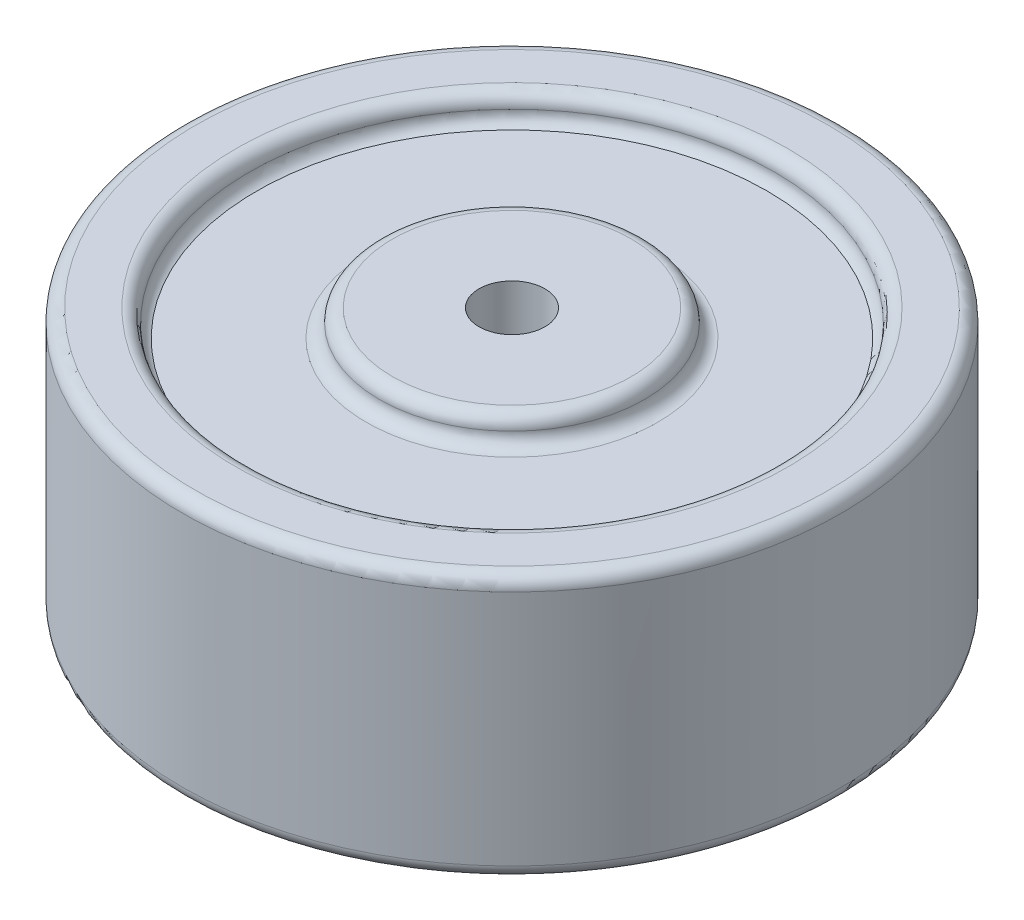
ISO-10303-21;
HEADER;
FILE_DESCRIPTION(('STEP AP214'),'2;1');
FILE_NAME('part.step','',(''),(''),'','','');
FILE_SCHEMA(('AUTOMOTIVE_DESIGN { 1 0 10303 214 1 1 1 1 }'));
ENDSEC;
DATA;
#1=APPLICATION_CONTEXT('core data for automotive mechanical design processes');
#2=APPLICATION_PROTOCOL_DEFINITION('international standard','automotive_design',2000,#1);
#3=PRODUCT_CONTEXT('',#1,'mechanical');
#4=PRODUCT('Part','Part','',(#3));
#5=PRODUCT_RELATED_PRODUCT_CATEGORY('part','',(#4));
#6=PRODUCT_DEFINITION_FORMATION('','',#4);
#7=PRODUCT_DEFINITION_CONTEXT('part definition',#1,'design');
#8=PRODUCT_DEFINITION('design','',#6,#7);
#9=PRODUCT_DEFINITION_SHAPE('','',#8);
#10=(LENGTH_UNIT() NAMED_UNIT(*) SI_UNIT(.MILLI.,.METRE.));
#11=(NAMED_UNIT(*) PLANE_ANGLE_UNIT() SI_UNIT($,.RADIAN.));
#12=(NAMED_UNIT(*) SI_UNIT($,.STERADIAN.) SOLID_ANGLE_UNIT());
#13=UNCERTAINTY_MEASURE_WITH_UNIT(LENGTH_MEASURE(1.E-05),#10,'distance_accuracy_value','');
#14=(GEOMETRIC_REPRESENTATION_CONTEXT(3) GLOBAL_UNCERTAINTY_ASSIGNED_CONTEXT((#13)) GLOBAL_UNIT_ASSIGNED_CONTEXT((#10,
#11,#12)) REPRESENTATION_CONTEXT('',''));
#15=CARTESIAN_POINT('',(0.,0.,0.));
#16=DIRECTION('',(0.,0.,1.));
#17=DIRECTION('',(1.,0.,0.));
#18=AXIS2_PLACEMENT_3D('',#15,#16,#17);
#19=CARTESIAN_POINT('',(0.,0.,0.));
#20=DIRECTION('',(0.,-1.,0.));
#21=DIRECTION('',(0.,0.,-0.999999999999996));
#22=AXIS2_PLACEMENT_3D('',#19,#20,#21);
#23=PLANE('',#22);
#24=CARTESIAN_POINT('',(0.,0.,0.));
#25=DIRECTION('',(0.,-1.,0.));
#26=DIRECTION('',(0.,0.,-0.999999999999996));
#27=AXIS2_PLACEMENT_3D('',#24,#25,#26);
#28=CIRCLE('',#27,2.5);
#29=CARTESIAN_POINT('',(0.,0.,-2.49999999999999));
#30=VERTEX_POINT('',#29);
#31=EDGE_CURVE('E125',#30,#30,#28,.F.);
#32=ORIENTED_EDGE('',*,*,#31,.F.);
#33=EDGE_LOOP('',(#32));
#34=FACE_BOUND('',#33,.T.);
#35=CARTESIAN_POINT('',(0.,0.,0.));
#36=DIRECTION('',(0.,-1.,0.));
#37=DIRECTION('',(0.,0.,-0.999999999999996));
#38=AXIS2_PLACEMENT_3D('',#35,#36,#37);
#39=CIRCLE('',#38,9.05594681126692);
#40=CARTESIAN_POINT('',(0.,0.,-9.05594681126689));
#41=VERTEX_POINT('',#40);
#42=EDGE_CURVE('E77',#41,#41,#39,.T.);
#43=ORIENTED_EDGE('',*,*,#42,.F.);
#44=EDGE_LOOP('',(#43));
#45=FACE_BOUND('',#44,.T.);
#46=ADVANCED_FACE('F51',(#34,#45),#23,.F.);
#47=CARTESIAN_POINT('',(0.,-0.999999999999834,1.4432899320127E-12));
#48=DIRECTION('',(0.,-1.,0.));
#49=DIRECTION('',(0.,0.,-0.999999999999996));
#50=AXIS2_PLACEMENT_3D('',#47,#48,#49);
#51=TOROIDAL_SURFACE('',#50,9.05594681126692,1.);
#52=CARTESIAN_POINT('',(0.,-0.999999999999834,1.4432899320127E-12));
#53=DIRECTION('',(0.,-1.,0.));
#54=DIRECTION('',(0.,0.,-0.999999999999996));
#55=AXIS2_PLACEMENT_3D('',#52,#53,#54);
#56=CIRCLE('',#55,10.0559468112669);
#57=CARTESIAN_POINT('',(0.,-0.999999999999837,-10.0559468112654));
#58=VERTEX_POINT('',#57);
#59=EDGE_CURVE('E81',#58,#58,#56,.T.);
#60=ORIENTED_EDGE('',*,*,#59,.F.);
#61=EDGE_LOOP('',(#60));
#62=FACE_BOUND('',#61,.T.);
#63=ORIENTED_EDGE('',*,*,#42,.T.);
#64=EDGE_LOOP('',(#63));
#65=FACE_BOUND('',#64,.T.);
#66=ADVANCED_FACE('F184',(#62,#65),#51,.T.);
#67=CARTESIAN_POINT('',(0.,-0.999999999999834,1.4432899320127E-12));
#68=DIRECTION('',(0.,-1.,0.));
#69=DIRECTION('',(0.,0.,-0.999999999999996));
#70=AXIS2_PLACEMENT_3D('',#67,#68,#69);
#71=TOROIDAL_SURFACE('',#70,11.0559468112669,1.);
#72=CARTESIAN_POINT('',(0.,-1.99999999999978,4.44089209850063E-13));
#73=DIRECTION('',(0.,-1.,0.));
#74=DIRECTION('',(0.,0.,-0.999999999999996));
#75=AXIS2_PLACEMENT_3D('',#72,#73,#74);
#76=CIRCLE('',#75,11.0559468112669);
#77=CARTESIAN_POINT('',(0.,-1.99999999999978,-11.0559468112664));
#78=VERTEX_POINT('',#77);
#79=EDGE_CURVE('E85',#78,#78,#76,.T.);
#80=ORIENTED_EDGE('',*,*,#79,.F.);
#81=EDGE_LOOP('',(#80));
#82=FACE_BOUND('',#81,.T.);
#83=ORIENTED_EDGE('',*,*,#59,.T.);
#84=EDGE_LOOP('',(#83));
#85=FACE_BOUND('',#84,.T.);
#86=ADVANCED_FACE('F190',(#82,#85),#71,.F.);
#87=CARTESIAN_POINT('',(-19.3546473356017,-2.00000000000004,2.15105711021124E-13));
#88=DIRECTION('',(0.,-1.,0.));
#89=DIRECTION('',(0.,0.,-0.999999999999996));
#90=AXIS2_PLACEMENT_3D('',#87,#88,#89);
#91=PLANE('',#90);
#92=CARTESIAN_POINT('',(0.,-1.99999999999978,4.44089209850063E-13));
#93=DIRECTION('',(0.,-1.,0.));
#94=DIRECTION('',(0.,0.,-0.999999999999996));
#95=AXIS2_PLACEMENT_3D('',#92,#93,#94);
#96=CIRCLE('',#95,19.3546473356019);
#97=CARTESIAN_POINT('',(0.,-1.99999999999979,-19.3546473356014));
#98=VERTEX_POINT('',#97);
#99=EDGE_CURVE('E89',#98,#98,#96,.T.);
#100=ORIENTED_EDGE('',*,*,#99,.F.);
#101=EDGE_LOOP('',(#100));
#102=FACE_BOUND('',#101,.T.);
#103=ORIENTED_EDGE('',*,*,#79,.T.);
#104=EDGE_LOOP('',(#103));
#105=FACE_BOUND('',#104,.T.);
#106=ADVANCED_FACE('F275',(#102,#105),#91,.F.);
#107=CARTESIAN_POINT('',(0.,-1.09458044996739,1.66533453693773E-12));
#108=DIRECTION('',(0.,-1.,0.));
#109=DIRECTION('',(0.,0.,-0.999999999999996));
#110=AXIS2_PLACEMENT_3D('',#107,#108,#109);
#111=TOROIDAL_SURFACE('',#110,18.930129446204,1.);
#112=CARTESIAN_POINT('',(-1.94289029309402E-13,-1.04729022498377,6.66133814775094E-13));
#113=DIRECTION('',(0.,-1.,0.));
#114=DIRECTION('',(0.,0.,-0.999999999999996));
#115=AXIS2_PLACEMENT_3D('',#112,#113,#114);
#116=CIRCLE('',#115,19.9290106376482);
#117=CARTESIAN_POINT('',(-1.95395311632798E-13,-1.04729022498378,-19.9290106376474));
#118=VERTEX_POINT('',#117);
#119=EDGE_CURVE('E93',#118,#118,#116,.T.);
#120=ORIENTED_EDGE('',*,*,#119,.F.);
#121=EDGE_LOOP('',(#120));
#122=FACE_BOUND('',#121,.T.);
#123=ORIENTED_EDGE('',*,*,#99,.T.);
#124=EDGE_LOOP('',(#123));
#125=FACE_BOUND('',#124,.T.);
#126=ADVANCED_FACE('F265',(#122,#125),#111,.F.);
#127=CARTESIAN_POINT('',(0.,-0.999999999999834,1.4432899320127E-12));
#128=DIRECTION('',(0.,-1.,0.));
#129=DIRECTION('',(0.,0.,-0.999999999999996));
#130=AXIS2_PLACEMENT_3D('',#127,#128,#129);
#131=TOROIDAL_SURFACE('',#130,20.9278918290924,1.);
#132=CARTESIAN_POINT('',(0.,0.,0.));
#133=DIRECTION('',(0.,-1.,0.));
#134=DIRECTION('',(0.,0.,-0.999999999999996));
#135=AXIS2_PLACEMENT_3D('',#132,#133,#134);
#136=CIRCLE('',#135,20.9278918290924);
#137=CARTESIAN_POINT('',(0.,0.,-20.9278918290923));
#138=VERTEX_POINT('',#137);
#139=EDGE_CURVE('E97',#138,#138,#136,.T.);
#140=ORIENTED_EDGE('',*,*,#139,.F.);
#141=EDGE_LOOP('',(#140));
#142=FACE_BOUND('',#141,.T.);
#143=ORIENTED_EDGE('',*,*,#119,.T.);
#144=EDGE_LOOP('',(#143));
#145=FACE_BOUND('',#144,.T.);
#146=ADVANCED_FACE('F256',(#142,#145),#131,.T.);
#147=CARTESIAN_POINT('',(-20.9278918290923,0.,1.32532873564628E-12));
#148=DIRECTION('',(0.,-1.,0.));
#149=DIRECTION('',(0.,0.,-0.999999999999996));
#150=AXIS2_PLACEMENT_3D('',#147,#148,#149);
#151=PLANE('',#150);
#152=CARTESIAN_POINT('',(0.,0.,0.));
#153=DIRECTION('',(0.,-1.,0.));
#154=DIRECTION('',(0.,0.,-0.999999999999996));
#155=AXIS2_PLACEMENT_3D('',#152,#153,#154);
#156=CIRCLE('',#155,24.);
#157=CARTESIAN_POINT('',(0.,0.,-23.9999999999999));
#158=VERTEX_POINT('',#157);
#159=EDGE_CURVE('E59',#158,#158,#156,.F.);
#160=ORIENTED_EDGE('',*,*,#159,.T.);
#161=EDGE_LOOP('',(#160));
#162=FACE_BOUND('',#161,.T.);
#163=ORIENTED_EDGE('',*,*,#139,.T.);
#164=EDGE_LOOP('',(#163));
#165=FACE_BOUND('',#164,.T.);
#166=ADVANCED_FACE('F180',(#162,#165),#151,.F.);
#167=CARTESIAN_POINT('',(0.,0.,0.));
#168=DIRECTION('',(0.,-1.,0.));
#169=DIRECTION('',(0.,0.,-0.999999999999996));
#170=AXIS2_PLACEMENT_3D('',#167,#168,#169);
#171=CYLINDRICAL_SURFACE('',#170,25.);
#172=CARTESIAN_POINT('',(0.,-0.999999999999834,1.4432899320127E-12));
#173=DIRECTION('',(0.,-1.,0.));
#174=DIRECTION('',(0.,0.,-0.999999999999996));
#175=AXIS2_PLACEMENT_3D('',#172,#173,#174);
#176=CIRCLE('',#175,25.);
#177=CARTESIAN_POINT('',(0.,-0.999999999999842,-24.9999999999985));
#178=VERTEX_POINT('',#177);
#179=EDGE_CURVE('E65',#178,#178,#176,.T.);
#180=ORIENTED_EDGE('',*,*,#179,.T.);
#181=EDGE_LOOP('',(#180));
#182=FACE_BOUND('',#181,.T.);
#183=CARTESIAN_POINT('',(0.,-18.9999999999999,8.88178419700125E-13));
#184=DIRECTION('',(0.,1.,0.));
#185=DIRECTION('',(0.,0.,0.999999999999996));
#186=AXIS2_PLACEMENT_3D('',#183,#184,#185);
#187=CIRCLE('',#186,25.);
#188=CARTESIAN_POINT('',(0.,-18.9999999999998,25.0000000000008));
#189=VERTEX_POINT('',#188);
#190=EDGE_CURVE('E71',#189,#189,#187,.T.);
#191=ORIENTED_EDGE('',*,*,#190,.T.);
#192=EDGE_LOOP('',(#191));
#193=FACE_BOUND('',#192,.T.);
#194=ADVANCED_FACE('F175',(#182,#193),#171,.T.);
#195=CARTESIAN_POINT('',(-20.9278918290924,-20.0000000000001,1.31838984174237E-12));
#196=DIRECTION('',(0.,1.,0.));
#197=DIRECTION('',(0.,0.,0.999999999999996));
#198=AXIS2_PLACEMENT_3D('',#195,#196,#197);
#199=PLANE('',#198);
#200=CARTESIAN_POINT('',(-1.94289029309402E-13,-19.9999999999998,2.08166817117217E-13));
#201=DIRECTION('',(0.,1.,0.));
#202=DIRECTION('',(0.,0.,0.999999999999996));
#203=AXIS2_PLACEMENT_3D('',#200,#201,#202);
#204=CIRCLE('',#203,24.);
#205=CARTESIAN_POINT('',(-1.92956761679852E-13,-19.9999999999998,24.0000000000001));
#206=VERTEX_POINT('',#205);
#207=EDGE_CURVE('E12',#206,#206,#204,.F.);
#208=ORIENTED_EDGE('',*,*,#207,.T.);
#209=EDGE_LOOP('',(#208));
#210=FACE_BOUND('',#209,.T.);
#211=CARTESIAN_POINT('',(-1.94289029309402E-13,-19.9999999999998,2.08166817117217E-13));
#212=DIRECTION('',(0.,-1.,0.));
#213=DIRECTION('',(0.,0.,-0.999999999999996));
#214=AXIS2_PLACEMENT_3D('',#211,#212,#213);
#215=CIRCLE('',#214,20.9278918290924);
#216=CARTESIAN_POINT('',(-1.95450760677679E-13,-19.9999999999998,-20.9278918290921));
#217=VERTEX_POINT('',#216);
#218=EDGE_CURVE('E101',#217,#217,#215,.T.);
#219=ORIENTED_EDGE('',*,*,#218,.F.);
#220=EDGE_LOOP('',(#219));
#221=FACE_BOUND('',#220,.T.);
#222=ADVANCED_FACE('F170',(#210,#221),#199,.F.);
#223=CARTESIAN_POINT('',(0.,-18.9999999999999,8.88178419700125E-13));
#224=DIRECTION('',(0.,-1.,0.));
#225=DIRECTION('',(0.,0.,-0.999999999999996));
#226=AXIS2_PLACEMENT_3D('',#223,#224,#225);
#227=TOROIDAL_SURFACE('',#226,20.9278918290924,1.);
#228=CARTESIAN_POINT('',(-2.4980018054066E-13,-18.9527097750162,9.99200722162641E-13));
#229=DIRECTION('',(0.,-1.,0.));
#230=DIRECTION('',(0.,0.,-0.999999999999996));
#231=AXIS2_PLACEMENT_3D('',#228,#229,#230);
#232=CIRCLE('',#231,19.9290106376482);
#233=CARTESIAN_POINT('',(-2.50906462864056E-13,-18.9527097750162,-19.9290106376471));
#234=VERTEX_POINT('',#233);
#235=EDGE_CURVE('E105',#234,#234,#232,.T.);
#236=ORIENTED_EDGE('',*,*,#235,.F.);
#237=EDGE_LOOP('',(#236));
#238=FACE_BOUND('',#237,.T.);
#239=ORIENTED_EDGE('',*,*,#218,.T.);
#240=EDGE_LOOP('',(#239));
#241=FACE_BOUND('',#240,.T.);
#242=ADVANCED_FACE('F164',(#238,#241),#227,.T.);
#243=CARTESIAN_POINT('',(0.,-18.9054195500326,1.346145417358E-12));
#244=DIRECTION('',(0.,-1.,0.));
#245=DIRECTION('',(0.,0.,-0.999999999999996));
#246=AXIS2_PLACEMENT_3D('',#243,#244,#245);
#247=TOROIDAL_SURFACE('',#246,18.930129446204,1.);
#248=CARTESIAN_POINT('',(0.,-18.0000000000001,1.11022302462516E-12));
#249=DIRECTION('',(0.,-1.,0.));
#250=DIRECTION('',(0.,0.,-0.999999999999996));
#251=AXIS2_PLACEMENT_3D('',#248,#249,#250);
#252=CIRCLE('',#251,19.3546473356019);
#253=CARTESIAN_POINT('',(0.,-18.0000000000001,-19.3546473356008));
#254=VERTEX_POINT('',#253);
#255=EDGE_CURVE('E109',#254,#254,#252,.T.);
#256=ORIENTED_EDGE('',*,*,#255,.F.);
#257=EDGE_LOOP('',(#256));
#258=FACE_BOUND('',#257,.T.);
#259=ORIENTED_EDGE('',*,*,#235,.T.);
#260=EDGE_LOOP('',(#259));
#261=FACE_BOUND('',#260,.T.);
#262=ADVANCED_FACE('F158',(#258,#261),#247,.F.);
#263=CARTESIAN_POINT('',(-19.3546473356018,-18.,1.4432899320127E-12));
#264=DIRECTION('',(0.,1.,0.));
#265=DIRECTION('',(0.,0.,0.999999999999996));
#266=AXIS2_PLACEMENT_3D('',#263,#264,#265);
#267=PLANE('',#266);
#268=CARTESIAN_POINT('',(0.,-18.0000000000001,1.11022302462516E-12));
#269=DIRECTION('',(0.,-1.,0.));
#270=DIRECTION('',(0.,0.,-0.999999999999996));
#271=AXIS2_PLACEMENT_3D('',#268,#269,#270);
#272=CIRCLE('',#271,11.0559468112669);
#273=CARTESIAN_POINT('',(0.,-18.0000000000001,-11.0559468112658));
#274=VERTEX_POINT('',#273);
#275=EDGE_CURVE('E113',#274,#274,#272,.T.);
#276=ORIENTED_EDGE('',*,*,#275,.F.);
#277=EDGE_LOOP('',(#276));
#278=FACE_BOUND('',#277,.T.);
#279=ORIENTED_EDGE('',*,*,#255,.T.);
#280=EDGE_LOOP('',(#279));
#281=FACE_BOUND('',#280,.T.);
#282=ADVANCED_FACE('F152',(#278,#281),#267,.F.);
#283=CARTESIAN_POINT('',(0.,-18.9999999999999,8.88178419700125E-13));
#284=DIRECTION('',(0.,-1.,0.));
#285=DIRECTION('',(0.,0.,-0.999999999999996));
#286=AXIS2_PLACEMENT_3D('',#283,#284,#285);
#287=TOROIDAL_SURFACE('',#286,11.0559468112669,0.999999999999998);
#288=CARTESIAN_POINT('',(0.,-18.9999999999999,8.88178419700125E-13));
#289=DIRECTION('',(0.,-1.,0.));
#290=DIRECTION('',(0.,0.,-0.999999999999996));
#291=AXIS2_PLACEMENT_3D('',#288,#289,#290);
#292=CIRCLE('',#291,10.0559468112669);
#293=CARTESIAN_POINT('',(0.,-18.9999999999999,-10.055946811266));
#294=VERTEX_POINT('',#293);
#295=EDGE_CURVE('E117',#294,#294,#292,.T.);
#296=ORIENTED_EDGE('',*,*,#295,.F.);
#297=EDGE_LOOP('',(#296));
#298=FACE_BOUND('',#297,.T.);
#299=ORIENTED_EDGE('',*,*,#275,.T.);
#300=EDGE_LOOP('',(#299));
#301=FACE_BOUND('',#300,.T.);
#302=ADVANCED_FACE('F146',(#298,#301),#287,.F.);
#303=CARTESIAN_POINT('',(0.,-18.9999999999999,8.88178419700125E-13));
#304=DIRECTION('',(0.,-1.,0.));
#305=DIRECTION('',(0.,0.,-0.999999999999996));
#306=AXIS2_PLACEMENT_3D('',#303,#304,#305);
#307=TOROIDAL_SURFACE('',#306,9.05594681126692,0.999999999999999);
#308=CARTESIAN_POINT('',(-1.94289029309402E-13,-19.9999999999998,2.08166817117217E-13));
#309=DIRECTION('',(0.,-1.,0.));
#310=DIRECTION('',(0.,0.,-0.999999999999996));
#311=AXIS2_PLACEMENT_3D('',#308,#309,#310);
#312=CIRCLE('',#311,9.05594681126692);
#313=CARTESIAN_POINT('',(-1.94791735342385E-13,-19.9999999999998,-9.05594681126668));
#314=VERTEX_POINT('',#313);
#315=EDGE_CURVE('E121',#314,#314,#312,.T.);
#316=ORIENTED_EDGE('',*,*,#315,.F.);
#317=EDGE_LOOP('',(#316));
#318=FACE_BOUND('',#317,.T.);
#319=ORIENTED_EDGE('',*,*,#295,.T.);
#320=EDGE_LOOP('',(#319));
#321=FACE_BOUND('',#320,.T.);
#322=ADVANCED_FACE('F140',(#318,#321),#307,.T.);
#323=CARTESIAN_POINT('',(-1.94289029309402E-13,-19.9999999999998,2.08166817117217E-13));
#324=DIRECTION('',(0.,1.,0.));
#325=DIRECTION('',(0.,0.,0.999999999999996));
#326=AXIS2_PLACEMENT_3D('',#323,#324,#325);
#327=PLANE('',#326);
#328=CARTESIAN_POINT('',(-1.94289029309402E-13,-19.9999999999998,2.08166817117217E-13));
#329=DIRECTION('',(0.,-1.,0.));
#330=DIRECTION('',(0.,0.,-0.999999999999996));
#331=AXIS2_PLACEMENT_3D('',#328,#329,#330);
#332=CIRCLE('',#331,2.5);
#333=CARTESIAN_POINT('',(-1.94427807187481E-13,-19.9999999999998,-2.49999999999978));
#334=VERTEX_POINT('',#333);
#335=EDGE_CURVE('E129',#334,#334,#332,.T.);
#336=ORIENTED_EDGE('',*,*,#335,.F.);
#337=EDGE_LOOP('',(#336));
#338=FACE_BOUND('',#337,.T.);
#339=ORIENTED_EDGE('',*,*,#315,.T.);
#340=EDGE_LOOP('',(#339));
#341=FACE_BOUND('',#340,.T.);
#342=ADVANCED_FACE('F137',(#338,#341),#327,.F.);
#343=CARTESIAN_POINT('',(1.52655665885959E-13,7.07106781186534,1.11022302462516E-12));
#344=DIRECTION('',(0.,-1.,0.));
#345=DIRECTION('',(0.,0.,-0.999999999999996));
#346=AXIS2_PLACEMENT_3D('',#343,#344,#345);
#347=CYLINDRICAL_SURFACE('',#346,2.5);
#348=ORIENTED_EDGE('',*,*,#31,.T.);
#349=EDGE_LOOP('',(#348));
#350=FACE_BOUND('',#349,.T.);
#351=ORIENTED_EDGE('',*,*,#335,.T.);
#352=EDGE_LOOP('',(#351));
#353=FACE_BOUND('',#352,.T.);
#354=ADVANCED_FACE('F135',(#350,#353),#347,.F.);
#355=CARTESIAN_POINT('',(0.,-0.999999999999834,1.4432899320127E-12));
#356=DIRECTION('',(0.,-1.,0.));
#357=DIRECTION('',(0.,0.,-0.999999999999996));
#358=AXIS2_PLACEMENT_3D('',#355,#356,#357);
#359=TOROIDAL_SURFACE('',#358,24.,1.);
#360=ORIENTED_EDGE('',*,*,#159,.F.);
#361=EDGE_LOOP('',(#360));
#362=FACE_BOUND('',#361,.T.);
#363=ORIENTED_EDGE('',*,*,#179,.F.);
#364=EDGE_LOOP('',(#363));
#365=FACE_BOUND('',#364,.T.);
#366=ADVANCED_FACE('F196',(#362,#365),#359,.T.);
#367=CARTESIAN_POINT('',(0.,-18.9999999999999,8.88178419700125E-13));
#368=DIRECTION('',(0.,1.,0.));
#369=DIRECTION('',(0.,0.,0.999999999999996));
#370=AXIS2_PLACEMENT_3D('',#367,#368,#369);
#371=TOROIDAL_SURFACE('',#370,24.,1.);
#372=ORIENTED_EDGE('',*,*,#190,.F.);
#373=EDGE_LOOP('',(#372));
#374=FACE_BOUND('',#373,.T.);
#375=ORIENTED_EDGE('',*,*,#207,.F.);
#376=EDGE_LOOP('',(#375));
#377=FACE_BOUND('',#376,.T.);
#378=ADVANCED_FACE('F53',(#374,#377),#371,.T.);
#379=CLOSED_SHELL('',(#46,#66,#86,#106,#126,#146,#166,#194,#222,#242,#262,#282,#302,#322,#342,
#354,#366,#378));
#380=MANIFOLD_SOLID_BREP('B2',#379);
#381=ADVANCED_BREP_SHAPE_REPRESENTATION('',(#18,#380),#14);
#382=SHAPE_DEFINITION_REPRESENTATION(#9,#381);
ENDSEC;
END-ISO-10303-21;
